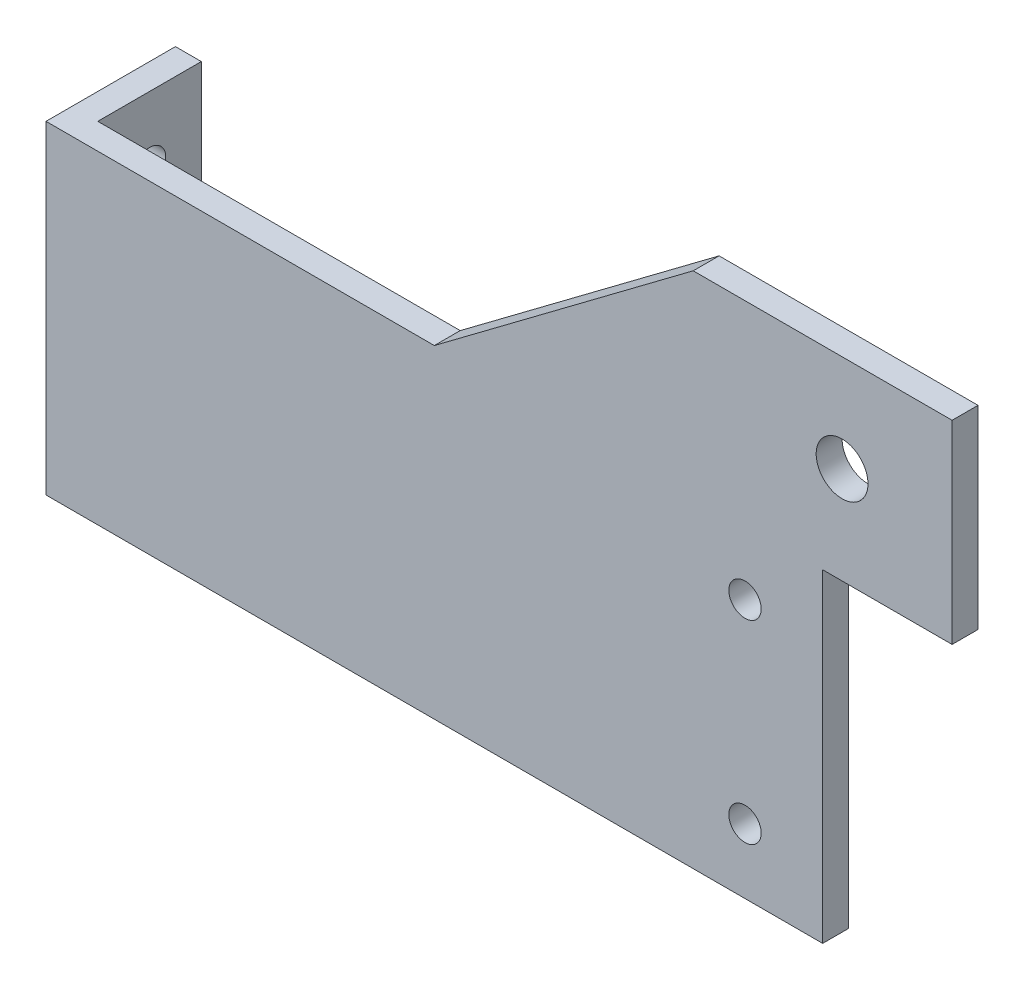
ISO-10303-21;
HEADER;
FILE_DESCRIPTION(('STEP AP214'),'2;1');
FILE_NAME('part.step','',(''),(''),'','','');
FILE_SCHEMA(('AUTOMOTIVE_DESIGN { 1 0 10303 214 1 1 1 1 }'));
ENDSEC;
DATA;
#1=APPLICATION_CONTEXT('core data for automotive mechanical design processes');
#2=APPLICATION_PROTOCOL_DEFINITION('international standard','automotive_design',2000,#1);
#3=PRODUCT_CONTEXT('',#1,'mechanical');
#4=PRODUCT('Part','Part','',(#3));
#5=PRODUCT_RELATED_PRODUCT_CATEGORY('part','',(#4));
#6=PRODUCT_DEFINITION_FORMATION('','',#4);
#7=PRODUCT_DEFINITION_CONTEXT('part definition',#1,'design');
#8=PRODUCT_DEFINITION('design','',#6,#7);
#9=PRODUCT_DEFINITION_SHAPE('','',#8);
#10=(LENGTH_UNIT() NAMED_UNIT(*) SI_UNIT(.MILLI.,.METRE.));
#11=(NAMED_UNIT(*) PLANE_ANGLE_UNIT() SI_UNIT($,.RADIAN.));
#12=(NAMED_UNIT(*) SI_UNIT($,.STERADIAN.) SOLID_ANGLE_UNIT());
#13=UNCERTAINTY_MEASURE_WITH_UNIT(LENGTH_MEASURE(1.E-05),#10,'distance_accuracy_value','');
#14=(GEOMETRIC_REPRESENTATION_CONTEXT(3) GLOBAL_UNCERTAINTY_ASSIGNED_CONTEXT((#13)) GLOBAL_UNIT_ASSIGNED_CONTEXT((#10,
#11,#12)) REPRESENTATION_CONTEXT('',''));
#15=CARTESIAN_POINT('',(0.,0.,0.));
#16=DIRECTION('',(0.,0.,1.));
#17=DIRECTION('',(1.,0.,0.));
#18=AXIS2_PLACEMENT_3D('',#15,#16,#17);
#19=CARTESIAN_POINT('',(0.,80.,0.));
#20=DIRECTION('',(0.,0.,-1.));
#21=DIRECTION('',(-1.,0.,0.));
#22=AXIS2_PLACEMENT_3D('',#19,#20,#21);
#23=PLANE('',#22);
#24=CARTESIAN_POINT('',(123.,65.,0.));
#25=DIRECTION('',(0.,0.,1.));
#26=DIRECTION('',(1.,0.,0.));
#27=AXIS2_PLACEMENT_3D('',#24,#25,#26);
#28=CIRCLE('',#27,3.99999999999999);
#29=CARTESIAN_POINT('',(127.,65.,0.));
#30=VERTEX_POINT('',#29);
#31=EDGE_CURVE('E152',#30,#30,#28,.T.);
#32=ORIENTED_EDGE('',*,*,#31,.F.);
#33=EDGE_LOOP('',(#32));
#34=FACE_BOUND('',#33,.T.);
#35=CARTESIAN_POINT('',(108.,10.,0.));
#36=DIRECTION('',(0.,0.,1.));
#37=DIRECTION('',(1.,0.,0.));
#38=AXIS2_PLACEMENT_3D('',#35,#36,#37);
#39=CIRCLE('',#38,2.49999999999999);
#40=CARTESIAN_POINT('',(110.5,10.,0.));
#41=VERTEX_POINT('',#40);
#42=EDGE_CURVE('E148',#41,#41,#39,.T.);
#43=ORIENTED_EDGE('',*,*,#42,.F.);
#44=EDGE_LOOP('',(#43));
#45=FACE_BOUND('',#44,.T.);
#46=CARTESIAN_POINT('',(108.,40.,0.));
#47=DIRECTION('',(0.,0.,1.));
#48=DIRECTION('',(1.,0.,0.));
#49=AXIS2_PLACEMENT_3D('',#46,#47,#48);
#50=CIRCLE('',#49,2.50000000000001);
#51=CARTESIAN_POINT('',(110.5,40.,0.));
#52=VERTEX_POINT('',#51);
#53=EDGE_CURVE('E144',#52,#52,#50,.T.);
#54=ORIENTED_EDGE('',*,*,#53,.F.);
#55=EDGE_LOOP('',(#54));
#56=FACE_BOUND('',#55,.T.);
#57=DIRECTION('',(1.,0.,0.));
#58=VECTOR('',#57,1.);
#59=CARTESIAN_POINT('',(0.,0.,0.));
#60=LINE('',#59,#58);
#61=CARTESIAN_POINT('',(0.,0.,0.));
#62=VERTEX_POINT('',#61);
#63=CARTESIAN_POINT('',(120.,0.,0.));
#64=VERTEX_POINT('',#63);
#65=EDGE_CURVE('E171',#62,#64,#60,.T.);
#66=ORIENTED_EDGE('',*,*,#65,.T.);
#67=DIRECTION('',(0.,-1.,0.));
#68=VECTOR('',#67,1.);
#69=CARTESIAN_POINT('',(120.,0.,0.));
#70=LINE('',#69,#68);
#71=CARTESIAN_POINT('',(120.,50.,0.));
#72=VERTEX_POINT('',#71);
#73=EDGE_CURVE('E49',#72,#64,#70,.T.);
#74=ORIENTED_EDGE('',*,*,#73,.F.);
#75=DIRECTION('',(-1.,0.,0.));
#76=VECTOR('',#75,1.);
#77=CARTESIAN_POINT('',(120.,50.,0.));
#78=LINE('',#77,#76);
#79=CARTESIAN_POINT('',(140.,50.,0.));
#80=VERTEX_POINT('',#79);
#81=EDGE_CURVE('E115',#80,#72,#78,.T.);
#82=ORIENTED_EDGE('',*,*,#81,.F.);
#83=DIRECTION('',(0.,-1.,0.));
#84=VECTOR('',#83,1.);
#85=CARTESIAN_POINT('',(140.,80.,0.));
#86=LINE('',#85,#84);
#87=CARTESIAN_POINT('',(140.,80.,0.));
#88=VERTEX_POINT('',#87);
#89=EDGE_CURVE('E126',#88,#80,#86,.T.);
#90=ORIENTED_EDGE('',*,*,#89,.F.);
#91=DIRECTION('',(1.,0.,0.));
#92=VECTOR('',#91,1.);
#93=CARTESIAN_POINT('',(0.,80.,0.));
#94=LINE('',#93,#92);
#95=CARTESIAN_POINT('',(100.,80.,0.));
#96=VERTEX_POINT('',#95);
#97=EDGE_CURVE('E184',#96,#88,#94,.T.);
#98=ORIENTED_EDGE('',*,*,#97,.F.);
#99=DIRECTION('',(0.8,0.6,0.));
#100=VECTOR('',#99,1.);
#101=CARTESIAN_POINT('',(60.,50.,0.));
#102=LINE('',#101,#100);
#103=CARTESIAN_POINT('',(60.,50.,0.));
#104=VERTEX_POINT('',#103);
#105=EDGE_CURVE('E57',#104,#96,#102,.T.);
#106=ORIENTED_EDGE('',*,*,#105,.F.);
#107=DIRECTION('',(1.,0.,0.));
#108=VECTOR('',#107,1.);
#109=CARTESIAN_POINT('',(0.,50.,0.));
#110=LINE('',#109,#108);
#111=CARTESIAN_POINT('',(0.,50.,0.));
#112=VERTEX_POINT('',#111);
#113=EDGE_CURVE('E164',#112,#104,#110,.T.);
#114=ORIENTED_EDGE('',*,*,#113,.F.);
#115=DIRECTION('',(0.,-1.,0.));
#116=VECTOR('',#115,1.);
#117=CARTESIAN_POINT('',(0.,80.,0.));
#118=LINE('',#117,#116);
#119=EDGE_CURVE('E131',#112,#62,#118,.T.);
#120=ORIENTED_EDGE('',*,*,#119,.T.);
#121=EDGE_LOOP('',(#66,#74,#82,#90,#98,#106,#114,#120));
#122=FACE_BOUND('',#121,.T.);
#123=ADVANCED_FACE('F35',(#34,#45,#56,#122),#23,.F.);
#124=CARTESIAN_POINT('',(140.,80.,0.));
#125=DIRECTION('',(-1.,0.,0.));
#126=DIRECTION('',(0.,0.,1.));
#127=AXIS2_PLACEMENT_3D('',#124,#125,#126);
#128=PLANE('',#127);
#129=ORIENTED_EDGE('',*,*,#89,.T.);
#130=DIRECTION('',(0.,0.,1.));
#131=VECTOR('',#130,1.);
#132=CARTESIAN_POINT('',(140.,50.,-10.));
#133=LINE('',#132,#131);
#134=CARTESIAN_POINT('',(140.,50.,-4.));
#135=VERTEX_POINT('',#134);
#136=EDGE_CURVE('E111',#135,#80,#133,.T.);
#137=ORIENTED_EDGE('',*,*,#136,.F.);
#138=DIRECTION('',(0.,-1.,0.));
#139=VECTOR('',#138,1.);
#140=CARTESIAN_POINT('',(140.,80.,-4.));
#141=LINE('',#140,#139);
#142=CARTESIAN_POINT('',(140.,80.,-4.));
#143=VERTEX_POINT('',#142);
#144=EDGE_CURVE('E132',#143,#135,#141,.T.);
#145=ORIENTED_EDGE('',*,*,#144,.F.);
#146=DIRECTION('',(0.,0.,-1.));
#147=VECTOR('',#146,1.);
#148=CARTESIAN_POINT('',(140.,80.,0.));
#149=LINE('',#148,#147);
#150=EDGE_CURVE('E130',#88,#143,#149,.T.);
#151=ORIENTED_EDGE('',*,*,#150,.F.);
#152=EDGE_LOOP('',(#129,#137,#145,#151));
#153=FACE_BOUND('',#152,.T.);
#154=ADVANCED_FACE('F129',(#153),#128,.F.);
#155=CARTESIAN_POINT('',(4.,80.,-4.));
#156=DIRECTION('',(0.,0.,1.));
#157=DIRECTION('',(1.,0.,0.));
#158=AXIS2_PLACEMENT_3D('',#155,#156,#157);
#159=PLANE('',#158);
#160=CARTESIAN_POINT('',(123.,65.,-4.));
#161=DIRECTION('',(0.,0.,1.));
#162=DIRECTION('',(1.,0.,0.));
#163=AXIS2_PLACEMENT_3D('',#160,#161,#162);
#164=CIRCLE('',#163,3.99999999999999);
#165=CARTESIAN_POINT('',(127.,65.,-4.));
#166=VERTEX_POINT('',#165);
#167=EDGE_CURVE('E149',#166,#166,#164,.T.);
#168=ORIENTED_EDGE('',*,*,#167,.T.);
#169=EDGE_LOOP('',(#168));
#170=FACE_BOUND('',#169,.T.);
#171=CARTESIAN_POINT('',(108.,10.,-4.));
#172=DIRECTION('',(0.,0.,1.));
#173=DIRECTION('',(1.,0.,0.));
#174=AXIS2_PLACEMENT_3D('',#171,#172,#173);
#175=CIRCLE('',#174,2.49999999999999);
#176=CARTESIAN_POINT('',(110.5,10.,-4.));
#177=VERTEX_POINT('',#176);
#178=EDGE_CURVE('E145',#177,#177,#175,.T.);
#179=ORIENTED_EDGE('',*,*,#178,.T.);
#180=EDGE_LOOP('',(#179));
#181=FACE_BOUND('',#180,.T.);
#182=CARTESIAN_POINT('',(108.,40.,-4.));
#183=DIRECTION('',(0.,0.,1.));
#184=DIRECTION('',(1.,0.,0.));
#185=AXIS2_PLACEMENT_3D('',#182,#183,#184);
#186=CIRCLE('',#185,2.50000000000001);
#187=CARTESIAN_POINT('',(110.5,40.,-4.));
#188=VERTEX_POINT('',#187);
#189=EDGE_CURVE('E140',#188,#188,#186,.T.);
#190=ORIENTED_EDGE('',*,*,#189,.T.);
#191=EDGE_LOOP('',(#190));
#192=FACE_BOUND('',#191,.T.);
#193=DIRECTION('',(-1.,0.,0.));
#194=VECTOR('',#193,1.);
#195=CARTESIAN_POINT('',(4.00000000000002,49.9999999999999,-4.));
#196=LINE('',#195,#194);
#197=CARTESIAN_POINT('',(120.,50.,-4.));
#198=VERTEX_POINT('',#197);
#199=EDGE_CURVE('E11',#135,#198,#196,.T.);
#200=ORIENTED_EDGE('',*,*,#199,.T.);
#201=DIRECTION('',(0.,-1.,0.));
#202=VECTOR('',#201,1.);
#203=CARTESIAN_POINT('',(120.,80.,-4.));
#204=LINE('',#203,#202);
#205=CARTESIAN_POINT('',(120.,0.,-4.));
#206=VERTEX_POINT('',#205);
#207=EDGE_CURVE('E155',#198,#206,#204,.T.);
#208=ORIENTED_EDGE('',*,*,#207,.T.);
#209=DIRECTION('',(-1.,0.,0.));
#210=VECTOR('',#209,1.);
#211=CARTESIAN_POINT('',(4.,0.,-4.));
#212=LINE('',#211,#210);
#213=CARTESIAN_POINT('',(4.,0.,-4.));
#214=VERTEX_POINT('',#213);
#215=EDGE_CURVE('E162',#206,#214,#212,.T.);
#216=ORIENTED_EDGE('',*,*,#215,.T.);
#217=DIRECTION('',(0.,-1.,0.));
#218=VECTOR('',#217,1.);
#219=CARTESIAN_POINT('',(4.,80.,-4.));
#220=LINE('',#219,#218);
#221=CARTESIAN_POINT('',(4.,50.,-4.));
#222=VERTEX_POINT('',#221);
#223=EDGE_CURVE('E136',#222,#214,#220,.T.);
#224=ORIENTED_EDGE('',*,*,#223,.F.);
#225=DIRECTION('',(1.,0.,0.));
#226=VECTOR('',#225,1.);
#227=CARTESIAN_POINT('',(4.,50.,-4.));
#228=LINE('',#227,#226);
#229=CARTESIAN_POINT('',(60.,50.,-4.));
#230=VERTEX_POINT('',#229);
#231=EDGE_CURVE('E196',#222,#230,#228,.T.);
#232=ORIENTED_EDGE('',*,*,#231,.T.);
#233=DIRECTION('',(0.8,0.6,0.));
#234=VECTOR('',#233,1.);
#235=CARTESIAN_POINT('',(38.56,33.92,-4.));
#236=LINE('',#235,#234);
#237=CARTESIAN_POINT('',(100.,80.,-4.));
#238=VERTEX_POINT('',#237);
#239=EDGE_CURVE('E198',#230,#238,#236,.T.);
#240=ORIENTED_EDGE('',*,*,#239,.T.);
#241=DIRECTION('',(-1.,0.,0.));
#242=VECTOR('',#241,1.);
#243=CARTESIAN_POINT('',(4.,80.,-4.));
#244=LINE('',#243,#242);
#245=EDGE_CURVE('E188',#143,#238,#244,.T.);
#246=ORIENTED_EDGE('',*,*,#245,.F.);
#247=ORIENTED_EDGE('',*,*,#144,.T.);
#248=EDGE_LOOP('',(#200,#208,#216,#224,#232,#240,#246,#247));
#249=FACE_BOUND('',#248,.T.);
#250=ADVANCED_FACE('F160',(#170,#181,#192,#249),#159,.F.);
#251=CARTESIAN_POINT('',(4.,80.,-4.));
#252=DIRECTION('',(-1.,0.,0.));
#253=DIRECTION('',(0.,0.,1.));
#254=AXIS2_PLACEMENT_3D('',#251,#252,#253);
#255=PLANE('',#254);
#256=CARTESIAN_POINT('',(4.,10.,-12.));
#257=DIRECTION('',(-1.,0.,0.));
#258=DIRECTION('',(0.,0.,1.));
#259=AXIS2_PLACEMENT_3D('',#256,#257,#258);
#260=CIRCLE('',#259,2.5);
#261=CARTESIAN_POINT('',(4.,10.,-9.5));
#262=VERTEX_POINT('',#261);
#263=EDGE_CURVE('E215',#262,#262,#260,.T.);
#264=ORIENTED_EDGE('',*,*,#263,.T.);
#265=EDGE_LOOP('',(#264));
#266=FACE_BOUND('',#265,.T.);
#267=CARTESIAN_POINT('',(4.,40.,-12.));
#268=DIRECTION('',(-1.,0.,0.));
#269=DIRECTION('',(0.,0.,1.));
#270=AXIS2_PLACEMENT_3D('',#267,#268,#269);
#271=CIRCLE('',#270,2.5);
#272=CARTESIAN_POINT('',(4.,40.,-9.5));
#273=VERTEX_POINT('',#272);
#274=EDGE_CURVE('E175',#273,#273,#271,.T.);
#275=ORIENTED_EDGE('',*,*,#274,.T.);
#276=EDGE_LOOP('',(#275));
#277=FACE_BOUND('',#276,.T.);
#278=DIRECTION('',(0.,-1.,0.));
#279=VECTOR('',#278,1.);
#280=CARTESIAN_POINT('',(4.,80.,-20.));
#281=LINE('',#280,#279);
#282=CARTESIAN_POINT('',(4.,50.,-20.));
#283=VERTEX_POINT('',#282);
#284=CARTESIAN_POINT('',(4.,0.,-20.));
#285=VERTEX_POINT('',#284);
#286=EDGE_CURVE('E187',#283,#285,#281,.T.);
#287=ORIENTED_EDGE('',*,*,#286,.F.);
#288=DIRECTION('',(0.,0.,1.));
#289=VECTOR('',#288,1.);
#290=CARTESIAN_POINT('',(4.,50.,-4.));
#291=LINE('',#290,#289);
#292=EDGE_CURVE('E193',#283,#222,#291,.T.);
#293=ORIENTED_EDGE('',*,*,#292,.T.);
#294=ORIENTED_EDGE('',*,*,#223,.T.);
#295=DIRECTION('',(0.,0.,-1.));
#296=VECTOR('',#295,1.);
#297=CARTESIAN_POINT('',(4.,0.,-4.));
#298=LINE('',#297,#296);
#299=EDGE_CURVE('E170',#214,#285,#298,.T.);
#300=ORIENTED_EDGE('',*,*,#299,.T.);
#301=EDGE_LOOP('',(#287,#293,#294,#300));
#302=FACE_BOUND('',#301,.T.);
#303=ADVANCED_FACE('F192',(#266,#277,#302),#255,.F.);
#304=CARTESIAN_POINT('',(0.,80.,-20.));
#305=DIRECTION('',(0.,0.,1.));
#306=DIRECTION('',(1.,0.,0.));
#307=AXIS2_PLACEMENT_3D('',#304,#305,#306);
#308=PLANE('',#307);
#309=DIRECTION('',(0.,-1.,0.));
#310=VECTOR('',#309,1.);
#311=CARTESIAN_POINT('',(0.,80.,-20.));
#312=LINE('',#311,#310);
#313=CARTESIAN_POINT('',(0.,50.,-20.));
#314=VERTEX_POINT('',#313);
#315=CARTESIAN_POINT('',(0.,0.,-20.));
#316=VERTEX_POINT('',#315);
#317=EDGE_CURVE('E185',#314,#316,#312,.T.);
#318=ORIENTED_EDGE('',*,*,#317,.F.);
#319=DIRECTION('',(1.,0.,0.));
#320=VECTOR('',#319,1.);
#321=CARTESIAN_POINT('',(0.,50.,-20.));
#322=LINE('',#321,#320);
#323=EDGE_CURVE('E205',#314,#283,#322,.T.);
#324=ORIENTED_EDGE('',*,*,#323,.T.);
#325=ORIENTED_EDGE('',*,*,#286,.T.);
#326=DIRECTION('',(-1.,0.,0.));
#327=VECTOR('',#326,1.);
#328=CARTESIAN_POINT('',(0.,0.,-20.));
#329=LINE('',#328,#327);
#330=EDGE_CURVE('E173',#285,#316,#329,.T.);
#331=ORIENTED_EDGE('',*,*,#330,.T.);
#332=EDGE_LOOP('',(#318,#324,#325,#331));
#333=FACE_BOUND('',#332,.T.);
#334=ADVANCED_FACE('F239',(#333),#308,.F.);
#335=CARTESIAN_POINT('',(0.,80.,-4.));
#336=DIRECTION('',(1.,0.,0.));
#337=DIRECTION('',(0.,0.,-1.));
#338=AXIS2_PLACEMENT_3D('',#335,#336,#337);
#339=PLANE('',#338);
#340=CARTESIAN_POINT('',(0.,10.,-12.));
#341=DIRECTION('',(-1.,0.,0.));
#342=DIRECTION('',(0.,0.,1.));
#343=AXIS2_PLACEMENT_3D('',#340,#341,#342);
#344=CIRCLE('',#343,2.5);
#345=CARTESIAN_POINT('',(0.,10.,-9.5));
#346=VERTEX_POINT('',#345);
#347=EDGE_CURVE('E143',#346,#346,#344,.T.);
#348=ORIENTED_EDGE('',*,*,#347,.F.);
#349=EDGE_LOOP('',(#348));
#350=FACE_BOUND('',#349,.T.);
#351=CARTESIAN_POINT('',(0.,40.,-12.));
#352=DIRECTION('',(-1.,0.,0.));
#353=DIRECTION('',(0.,0.,1.));
#354=AXIS2_PLACEMENT_3D('',#351,#352,#353);
#355=CIRCLE('',#354,2.5);
#356=CARTESIAN_POINT('',(0.,40.,-9.5));
#357=VERTEX_POINT('',#356);
#358=EDGE_CURVE('E218',#357,#357,#355,.T.);
#359=ORIENTED_EDGE('',*,*,#358,.F.);
#360=EDGE_LOOP('',(#359));
#361=FACE_BOUND('',#360,.T.);
#362=ORIENTED_EDGE('',*,*,#119,.F.);
#363=DIRECTION('',(0.,0.,1.));
#364=VECTOR('',#363,1.);
#365=CARTESIAN_POINT('',(0.,50.,-30.));
#366=LINE('',#365,#364);
#367=EDGE_CURVE('E229',#314,#112,#366,.T.);
#368=ORIENTED_EDGE('',*,*,#367,.F.);
#369=ORIENTED_EDGE('',*,*,#317,.T.);
#370=DIRECTION('',(0.,0.,1.));
#371=VECTOR('',#370,1.);
#372=CARTESIAN_POINT('',(0.,0.,-4.));
#373=LINE('',#372,#371);
#374=EDGE_CURVE('E181',#316,#62,#373,.T.);
#375=ORIENTED_EDGE('',*,*,#374,.T.);
#376=EDGE_LOOP('',(#362,#368,#369,#375));
#377=FACE_BOUND('',#376,.T.);
#378=ADVANCED_FACE('F243',(#350,#361,#377),#339,.F.);
#379=CARTESIAN_POINT('',(0.,80.,0.));
#380=DIRECTION('',(0.,-1.,0.));
#381=DIRECTION('',(0.,0.,-1.));
#382=AXIS2_PLACEMENT_3D('',#379,#380,#381);
#383=PLANE('',#382);
#384=ORIENTED_EDGE('',*,*,#245,.T.);
#385=DIRECTION('',(0.,0.,1.));
#386=VECTOR('',#385,1.);
#387=CARTESIAN_POINT('',(100.,80.,0.));
#388=LINE('',#387,#386);
#389=EDGE_CURVE('E134',#238,#96,#388,.T.);
#390=ORIENTED_EDGE('',*,*,#389,.T.);
#391=ORIENTED_EDGE('',*,*,#97,.T.);
#392=ORIENTED_EDGE('',*,*,#150,.T.);
#393=EDGE_LOOP('',(#384,#390,#391,#392));
#394=FACE_BOUND('',#393,.T.);
#395=ADVANCED_FACE('F225',(#394),#383,.F.);
#396=CARTESIAN_POINT('',(0.,0.,0.));
#397=DIRECTION('',(0.,-1.,0.));
#398=DIRECTION('',(0.,0.,-1.));
#399=AXIS2_PLACEMENT_3D('',#396,#397,#398);
#400=PLANE('',#399);
#401=DIRECTION('',(0.,0.,-1.));
#402=VECTOR('',#401,1.);
#403=CARTESIAN_POINT('',(120.,0.,0.));
#404=LINE('',#403,#402);
#405=EDGE_CURVE('E42',#64,#206,#404,.T.);
#406=ORIENTED_EDGE('',*,*,#405,.F.);
#407=ORIENTED_EDGE('',*,*,#65,.F.);
#408=ORIENTED_EDGE('',*,*,#374,.F.);
#409=ORIENTED_EDGE('',*,*,#330,.F.);
#410=ORIENTED_EDGE('',*,*,#299,.F.);
#411=ORIENTED_EDGE('',*,*,#215,.F.);
#412=EDGE_LOOP('',(#406,#407,#408,#409,#410,#411));
#413=FACE_BOUND('',#412,.T.);
#414=ADVANCED_FACE('F167',(#413),#400,.T.);
#415=CARTESIAN_POINT('',(10.,40.,-12.));
#416=DIRECTION('',(-1.,0.,0.));
#417=DIRECTION('',(0.,0.,1.));
#418=AXIS2_PLACEMENT_3D('',#415,#416,#417);
#419=CYLINDRICAL_SURFACE('',#418,2.5);
#420=ORIENTED_EDGE('',*,*,#358,.T.);
#421=EDGE_LOOP('',(#420));
#422=FACE_BOUND('',#421,.T.);
#423=ORIENTED_EDGE('',*,*,#274,.F.);
#424=EDGE_LOOP('',(#423));
#425=FACE_BOUND('',#424,.T.);
#426=ADVANCED_FACE('F301',(#422,#425),#419,.F.);
#427=CARTESIAN_POINT('',(10.,10.,-12.));
#428=DIRECTION('',(-1.,0.,0.));
#429=DIRECTION('',(0.,0.,1.));
#430=AXIS2_PLACEMENT_3D('',#427,#428,#429);
#431=CYLINDRICAL_SURFACE('',#430,2.5);
#432=ORIENTED_EDGE('',*,*,#347,.T.);
#433=EDGE_LOOP('',(#432));
#434=FACE_BOUND('',#433,.T.);
#435=ORIENTED_EDGE('',*,*,#263,.F.);
#436=EDGE_LOOP('',(#435));
#437=FACE_BOUND('',#436,.T.);
#438=ADVANCED_FACE('F272',(#434,#437),#431,.F.);
#439=CARTESIAN_POINT('',(108.,40.,-10.));
#440=DIRECTION('',(0.,0.,1.));
#441=DIRECTION('',(1.,0.,0.));
#442=AXIS2_PLACEMENT_3D('',#439,#440,#441);
#443=CYLINDRICAL_SURFACE('',#442,2.50000000000001);
#444=ORIENTED_EDGE('',*,*,#53,.T.);
#445=EDGE_LOOP('',(#444));
#446=FACE_BOUND('',#445,.T.);
#447=ORIENTED_EDGE('',*,*,#189,.F.);
#448=EDGE_LOOP('',(#447));
#449=FACE_BOUND('',#448,.T.);
#450=ADVANCED_FACE('F268',(#446,#449),#443,.F.);
#451=CARTESIAN_POINT('',(108.,10.,-10.));
#452=DIRECTION('',(0.,0.,1.));
#453=DIRECTION('',(1.,0.,0.));
#454=AXIS2_PLACEMENT_3D('',#451,#452,#453);
#455=CYLINDRICAL_SURFACE('',#454,2.49999999999999);
#456=ORIENTED_EDGE('',*,*,#42,.T.);
#457=EDGE_LOOP('',(#456));
#458=FACE_BOUND('',#457,.T.);
#459=ORIENTED_EDGE('',*,*,#178,.F.);
#460=EDGE_LOOP('',(#459));
#461=FACE_BOUND('',#460,.T.);
#462=ADVANCED_FACE('F271',(#458,#461),#455,.F.);
#463=CARTESIAN_POINT('',(123.,65.,-10.));
#464=DIRECTION('',(0.,0.,1.));
#465=DIRECTION('',(1.,0.,0.));
#466=AXIS2_PLACEMENT_3D('',#463,#464,#465);
#467=CYLINDRICAL_SURFACE('',#466,3.99999999999999);
#468=ORIENTED_EDGE('',*,*,#31,.T.);
#469=EDGE_LOOP('',(#468));
#470=FACE_BOUND('',#469,.T.);
#471=ORIENTED_EDGE('',*,*,#167,.F.);
#472=EDGE_LOOP('',(#471));
#473=FACE_BOUND('',#472,.T.);
#474=ADVANCED_FACE('F289',(#470,#473),#467,.F.);
#475=CARTESIAN_POINT('',(0.,50.,-30.));
#476=DIRECTION('',(0.,-1.,0.));
#477=DIRECTION('',(0.,0.,-1.));
#478=AXIS2_PLACEMENT_3D('',#475,#476,#477);
#479=PLANE('',#478);
#480=ORIENTED_EDGE('',*,*,#292,.F.);
#481=ORIENTED_EDGE('',*,*,#323,.F.);
#482=ORIENTED_EDGE('',*,*,#367,.T.);
#483=ORIENTED_EDGE('',*,*,#113,.T.);
#484=DIRECTION('',(0.,0.,1.));
#485=VECTOR('',#484,1.);
#486=CARTESIAN_POINT('',(60.,50.,-30.));
#487=LINE('',#486,#485);
#488=EDGE_CURVE('E231',#230,#104,#487,.T.);
#489=ORIENTED_EDGE('',*,*,#488,.F.);
#490=ORIENTED_EDGE('',*,*,#231,.F.);
#491=EDGE_LOOP('',(#480,#481,#482,#483,#489,#490));
#492=FACE_BOUND('',#491,.T.);
#493=ADVANCED_FACE('F241',(#492),#479,.F.);
#494=CARTESIAN_POINT('',(60.,50.,-30.));
#495=DIRECTION('',(0.6,-0.8,0.));
#496=DIRECTION('',(0.8,0.6,0.));
#497=AXIS2_PLACEMENT_3D('',#494,#495,#496);
#498=PLANE('',#497);
#499=ORIENTED_EDGE('',*,*,#488,.T.);
#500=ORIENTED_EDGE('',*,*,#105,.T.);
#501=ORIENTED_EDGE('',*,*,#389,.F.);
#502=ORIENTED_EDGE('',*,*,#239,.F.);
#503=EDGE_LOOP('',(#499,#500,#501,#502));
#504=FACE_BOUND('',#503,.T.);
#505=ADVANCED_FACE('F364',(#504),#498,.F.);
#506=CARTESIAN_POINT('',(120.,50.,-10.));
#507=DIRECTION('',(0.,1.,0.));
#508=DIRECTION('',(-1.,0.,0.));
#509=AXIS2_PLACEMENT_3D('',#506,#507,#508);
#510=PLANE('',#509);
#511=ORIENTED_EDGE('',*,*,#136,.T.);
#512=ORIENTED_EDGE('',*,*,#81,.T.);
#513=DIRECTION('',(0.,0.,1.));
#514=VECTOR('',#513,1.);
#515=CARTESIAN_POINT('',(120.,50.,-10.));
#516=LINE('',#515,#514);
#517=EDGE_CURVE('E120',#198,#72,#516,.T.);
#518=ORIENTED_EDGE('',*,*,#517,.F.);
#519=ORIENTED_EDGE('',*,*,#199,.F.);
#520=EDGE_LOOP('',(#511,#512,#518,#519));
#521=FACE_BOUND('',#520,.T.);
#522=ADVANCED_FACE('F113',(#521),#510,.F.);
#523=CARTESIAN_POINT('',(120.,0.,-10.));
#524=DIRECTION('',(-1.,0.,0.));
#525=DIRECTION('',(0.,0.,1.));
#526=AXIS2_PLACEMENT_3D('',#523,#524,#525);
#527=PLANE('',#526);
#528=ORIENTED_EDGE('',*,*,#517,.T.);
#529=ORIENTED_EDGE('',*,*,#73,.T.);
#530=ORIENTED_EDGE('',*,*,#405,.T.);
#531=ORIENTED_EDGE('',*,*,#207,.F.);
#532=EDGE_LOOP('',(#528,#529,#530,#531));
#533=FACE_BOUND('',#532,.T.);
#534=ADVANCED_FACE('F154',(#533),#527,.F.);
#535=CLOSED_SHELL('',(#123,#154,#250,#303,#334,#378,#395,#414,#426,#438,#450,#462,#474,#493,
#505,#522,#534));
#536=MANIFOLD_SOLID_BREP('B2',#535);
#537=ADVANCED_BREP_SHAPE_REPRESENTATION('',(#18,#536),#14);
#538=SHAPE_DEFINITION_REPRESENTATION(#9,#537);
ENDSEC;
END-ISO-10303-21;
